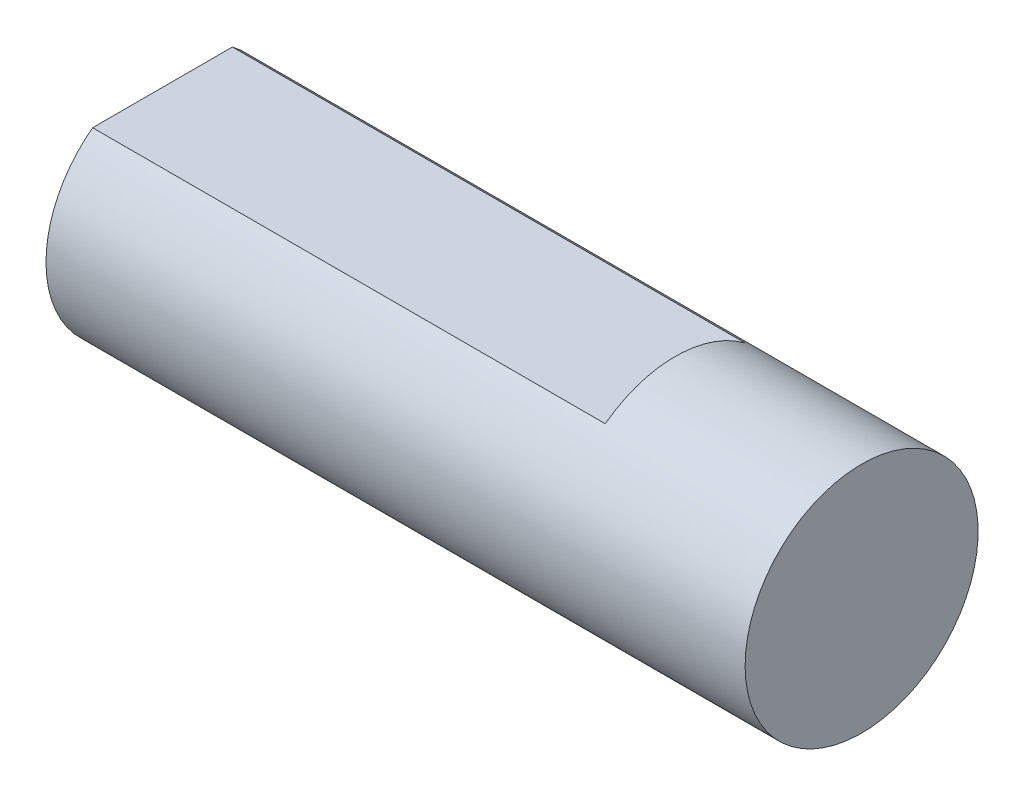
ISO-10303-21;
HEADER;
FILE_DESCRIPTION(('STEP AP214'),'2;1');
FILE_NAME('part.step','',(''),(''),'','','');
FILE_SCHEMA(('AUTOMOTIVE_DESIGN { 1 0 10303 214 1 1 1 1 }'));
ENDSEC;
DATA;
#1=APPLICATION_CONTEXT('core data for automotive mechanical design processes');
#2=APPLICATION_PROTOCOL_DEFINITION('international standard','automotive_design',2000,#1);
#3=PRODUCT_CONTEXT('',#1,'mechanical');
#4=PRODUCT('Part','Part','',(#3));
#5=PRODUCT_RELATED_PRODUCT_CATEGORY('part','',(#4));
#6=PRODUCT_DEFINITION_FORMATION('','',#4);
#7=PRODUCT_DEFINITION_CONTEXT('part definition',#1,'design');
#8=PRODUCT_DEFINITION('design','',#6,#7);
#9=PRODUCT_DEFINITION_SHAPE('','',#8);
#10=(LENGTH_UNIT() NAMED_UNIT(*) SI_UNIT(.MILLI.,.METRE.));
#11=(NAMED_UNIT(*) PLANE_ANGLE_UNIT() SI_UNIT($,.RADIAN.));
#12=(NAMED_UNIT(*) SI_UNIT($,.STERADIAN.) SOLID_ANGLE_UNIT());
#13=UNCERTAINTY_MEASURE_WITH_UNIT(LENGTH_MEASURE(1.E-05),#10,'distance_accuracy_value','');
#14=(GEOMETRIC_REPRESENTATION_CONTEXT(3) GLOBAL_UNCERTAINTY_ASSIGNED_CONTEXT((#13)) GLOBAL_UNIT_ASSIGNED_CONTEXT((#10,
#11,#12)) REPRESENTATION_CONTEXT('',''));
#15=CARTESIAN_POINT('',(0.,0.,0.));
#16=DIRECTION('',(0.,0.,1.));
#17=DIRECTION('',(1.,0.,0.));
#18=AXIS2_PLACEMENT_3D('',#15,#16,#17);
#19=CARTESIAN_POINT('',(7.5,1.25,0.));
#20=DIRECTION('',(-1.,0.,0.));
#21=DIRECTION('',(0.,0.,1.));
#22=AXIS2_PLACEMENT_3D('',#19,#20,#21);
#23=PLANE('',#22);
#24=CARTESIAN_POINT('',(7.5,-1.25,0.));
#25=DIRECTION('',(-1.,0.,0.));
#26=DIRECTION('',(0.,0.,1.));
#27=AXIS2_PLACEMENT_3D('',#24,#25,#26);
#28=CIRCLE('',#27,2.5);
#29=CARTESIAN_POINT('',(7.5,-1.25,2.5));
#30=VERTEX_POINT('',#29);
#31=EDGE_CURVE('E11',#30,#30,#28,.T.);
#32=ORIENTED_EDGE('',*,*,#31,.F.);
#33=EDGE_LOOP('',(#32));
#34=FACE_BOUND('',#33,.T.);
#35=ADVANCED_FACE('F35',(#34),#23,.F.);
#36=CARTESIAN_POINT('',(-7.5,-1.25,0.));
#37=DIRECTION('',(-1.,0.,0.));
#38=DIRECTION('',(0.,0.,1.));
#39=AXIS2_PLACEMENT_3D('',#36,#37,#38);
#40=CYLINDRICAL_SURFACE('',#39,2.5);
#41=CARTESIAN_POINT('',(3.5,-1.25,0.));
#42=DIRECTION('',(-1.,0.,0.));
#43=DIRECTION('',(0.,0.,1.));
#44=AXIS2_PLACEMENT_3D('',#41,#42,#43);
#45=CIRCLE('',#44,2.5);
#46=CARTESIAN_POINT('',(3.5,0.75,1.5));
#47=VERTEX_POINT('',#46);
#48=CARTESIAN_POINT('',(3.5,0.75,-1.5));
#49=VERTEX_POINT('',#48);
#50=EDGE_CURVE('E65',#47,#49,#45,.T.);
#51=ORIENTED_EDGE('',*,*,#50,.F.);
#52=DIRECTION('',(-1.,0.,0.));
#53=VECTOR('',#52,1.);
#54=CARTESIAN_POINT('',(3.5,0.75,1.5));
#55=LINE('',#54,#53);
#56=CARTESIAN_POINT('',(-7.5,0.75,1.5));
#57=VERTEX_POINT('',#56);
#58=EDGE_CURVE('E55',#47,#57,#55,.T.);
#59=ORIENTED_EDGE('',*,*,#58,.T.);
#60=CARTESIAN_POINT('',(-7.5,-1.25,0.));
#61=DIRECTION('',(-1.,0.,0.));
#62=DIRECTION('',(0.,0.,1.));
#63=AXIS2_PLACEMENT_3D('',#60,#61,#62);
#64=CIRCLE('',#63,2.5);
#65=CARTESIAN_POINT('',(-7.5,0.75,-1.5));
#66=VERTEX_POINT('',#65);
#67=EDGE_CURVE('E42',#66,#57,#64,.T.);
#68=ORIENTED_EDGE('',*,*,#67,.F.);
#69=DIRECTION('',(-1.,0.,0.));
#70=VECTOR('',#69,1.);
#71=CARTESIAN_POINT('',(3.5,0.75,-1.5));
#72=LINE('',#71,#70);
#73=EDGE_CURVE('E49',#49,#66,#72,.T.);
#74=ORIENTED_EDGE('',*,*,#73,.F.);
#75=EDGE_LOOP('',(#51,#59,#68,#74));
#76=FACE_BOUND('',#75,.T.);
#77=ORIENTED_EDGE('',*,*,#31,.T.);
#78=EDGE_LOOP('',(#77));
#79=FACE_BOUND('',#78,.T.);
#80=ADVANCED_FACE('F69',(#76,#79),#40,.T.);
#81=CARTESIAN_POINT('',(-7.5,1.25,0.));
#82=DIRECTION('',(1.,0.,0.));
#83=DIRECTION('',(0.,0.,-1.));
#84=AXIS2_PLACEMENT_3D('',#81,#82,#83);
#85=PLANE('',#84);
#86=ORIENTED_EDGE('',*,*,#67,.T.);
#87=DIRECTION('',(0.,0.,1.));
#88=VECTOR('',#87,1.);
#89=CARTESIAN_POINT('',(-7.5,0.75,-1.5));
#90=LINE('',#89,#88);
#91=EDGE_CURVE('E60',#66,#57,#90,.T.);
#92=ORIENTED_EDGE('',*,*,#91,.F.);
#93=EDGE_LOOP('',(#86,#92));
#94=FACE_BOUND('',#93,.T.);
#95=ADVANCED_FACE('F72',(#94),#85,.F.);
#96=CARTESIAN_POINT('',(3.5,0.75,-1.5));
#97=DIRECTION('',(0.,-1.,0.));
#98=DIRECTION('',(0.,0.,-1.));
#99=AXIS2_PLACEMENT_3D('',#96,#97,#98);
#100=PLANE('',#99);
#101=ORIENTED_EDGE('',*,*,#91,.T.);
#102=ORIENTED_EDGE('',*,*,#58,.F.);
#103=DIRECTION('',(0.,0.,1.));
#104=VECTOR('',#103,1.);
#105=CARTESIAN_POINT('',(3.5,0.75,-1.5));
#106=LINE('',#105,#104);
#107=EDGE_CURVE('E74',#49,#47,#106,.T.);
#108=ORIENTED_EDGE('',*,*,#107,.F.);
#109=ORIENTED_EDGE('',*,*,#73,.T.);
#110=EDGE_LOOP('',(#101,#102,#108,#109));
#111=FACE_BOUND('',#110,.T.);
#112=ADVANCED_FACE('F61',(#111),#100,.F.);
#113=CARTESIAN_POINT('',(3.5,-1.25,0.));
#114=DIRECTION('',(-1.,0.,0.));
#115=DIRECTION('',(0.,0.,1.));
#116=AXIS2_PLACEMENT_3D('',#113,#114,#115);
#117=PLANE('',#116);
#118=ORIENTED_EDGE('',*,*,#50,.T.);
#119=ORIENTED_EDGE('',*,*,#107,.T.);
#120=EDGE_LOOP('',(#118,#119));
#121=FACE_BOUND('',#120,.T.);
#122=ADVANCED_FACE('F78',(#121),#117,.T.);
#123=CLOSED_SHELL('',(#35,#80,#95,#112,#122));
#124=MANIFOLD_SOLID_BREP('B2',#123);
#125=ADVANCED_BREP_SHAPE_REPRESENTATION('',(#18,#124),#14);
#126=SHAPE_DEFINITION_REPRESENTATION(#9,#125);
ENDSEC;
END-ISO-10303-21;
